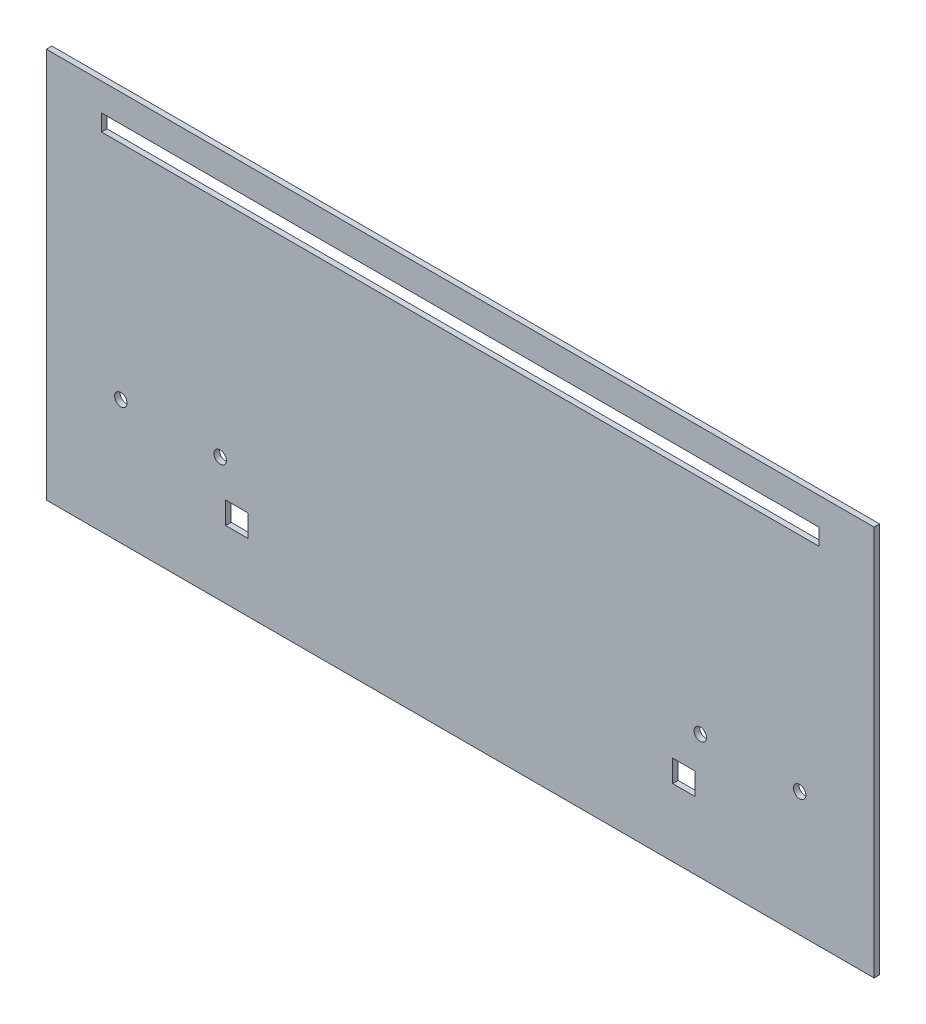
ISO-10303-21;
HEADER;
FILE_DESCRIPTION(('STEP AP214'),'2;1');
FILE_NAME('part.step','',(''),(''),'','','');
FILE_SCHEMA(('AUTOMOTIVE_DESIGN { 1 0 10303 214 1 1 1 1 }'));
ENDSEC;
DATA;
#1=APPLICATION_CONTEXT('core data for automotive mechanical design processes');
#2=APPLICATION_PROTOCOL_DEFINITION('international standard','automotive_design',2000,#1);
#3=PRODUCT_CONTEXT('',#1,'mechanical');
#4=PRODUCT('Part','Part','',(#3));
#5=PRODUCT_RELATED_PRODUCT_CATEGORY('part','',(#4));
#6=PRODUCT_DEFINITION_FORMATION('','',#4);
#7=PRODUCT_DEFINITION_CONTEXT('part definition',#1,'design');
#8=PRODUCT_DEFINITION('design','',#6,#7);
#9=PRODUCT_DEFINITION_SHAPE('','',#8);
#10=(LENGTH_UNIT() NAMED_UNIT(*) SI_UNIT(.MILLI.,.METRE.));
#11=(NAMED_UNIT(*) PLANE_ANGLE_UNIT() SI_UNIT($,.RADIAN.));
#12=(NAMED_UNIT(*) SI_UNIT($,.STERADIAN.) SOLID_ANGLE_UNIT());
#13=UNCERTAINTY_MEASURE_WITH_UNIT(LENGTH_MEASURE(1.E-05),#10,'distance_accuracy_value','');
#14=(GEOMETRIC_REPRESENTATION_CONTEXT(3) GLOBAL_UNCERTAINTY_ASSIGNED_CONTEXT((#13)) GLOBAL_UNIT_ASSIGNED_CONTEXT((#10,
#11,#12)) REPRESENTATION_CONTEXT('',''));
#15=CARTESIAN_POINT('',(0.,0.,0.));
#16=DIRECTION('',(0.,0.,1.));
#17=DIRECTION('',(1.,0.,0.));
#18=AXIS2_PLACEMENT_3D('',#15,#16,#17);
#19=CARTESIAN_POINT('',(0.,0.,2.));
#20=DIRECTION('',(0.,0.,-1.));
#21=DIRECTION('',(-1.,0.,0.));
#22=AXIS2_PLACEMENT_3D('',#19,#20,#21);
#23=PLANE('',#22);
#24=DIRECTION('',(0.,-1.,0.));
#25=VECTOR('',#24,1.);
#26=CARTESIAN_POINT('',(-85.,24.5,2.));
#27=LINE('',#26,#25);
#28=CARTESIAN_POINT('',(-85.,32.5,2.));
#29=VERTEX_POINT('',#28);
#30=CARTESIAN_POINT('',(-85.,24.5,2.));
#31=VERTEX_POINT('',#30);
#32=EDGE_CURVE('E210',#29,#31,#27,.T.);
#33=ORIENTED_EDGE('',*,*,#32,.F.);
#34=DIRECTION('',(-1.,0.,0.));
#35=VECTOR('',#34,1.);
#36=CARTESIAN_POINT('',(-85.,32.5,2.));
#37=LINE('',#36,#35);
#38=CARTESIAN_POINT('',(-77.,32.5,2.));
#39=VERTEX_POINT('',#38);
#40=EDGE_CURVE('E205',#39,#29,#37,.T.);
#41=ORIENTED_EDGE('',*,*,#40,.F.);
#42=DIRECTION('',(0.,1.,0.));
#43=VECTOR('',#42,1.);
#44=CARTESIAN_POINT('',(-77.,24.5,2.));
#45=LINE('',#44,#43);
#46=CARTESIAN_POINT('',(-77.,24.5,2.));
#47=VERTEX_POINT('',#46);
#48=EDGE_CURVE('E217',#47,#39,#45,.T.);
#49=ORIENTED_EDGE('',*,*,#48,.F.);
#50=DIRECTION('',(1.,0.,0.));
#51=VECTOR('',#50,1.);
#52=CARTESIAN_POINT('',(-85.,24.5,2.));
#53=LINE('',#52,#51);
#54=EDGE_CURVE('E219',#31,#47,#53,.T.);
#55=ORIENTED_EDGE('',*,*,#54,.F.);
#56=EDGE_LOOP('',(#33,#41,#49,#55));
#57=FACE_BOUND('',#56,.T.);
#58=CARTESIAN_POINT('',(123.,45.,2.));
#59=DIRECTION('',(0.,0.,1.));
#60=DIRECTION('',(1.,0.,0.));
#61=AXIS2_PLACEMENT_3D('',#58,#59,#60);
#62=CIRCLE('',#61,2.25);
#63=CARTESIAN_POINT('',(125.25,45.,2.));
#64=VERTEX_POINT('',#63);
#65=EDGE_CURVE('E223',#64,#64,#62,.T.);
#66=ORIENTED_EDGE('',*,*,#65,.F.);
#67=EDGE_LOOP('',(#66));
#68=FACE_BOUND('',#67,.T.);
#69=CARTESIAN_POINT('',(-87.,45.,2.));
#70=DIRECTION('',(0.,0.,1.));
#71=DIRECTION('',(1.,0.,0.));
#72=AXIS2_PLACEMENT_3D('',#69,#70,#71);
#73=CIRCLE('',#72,2.25);
#74=CARTESIAN_POINT('',(-84.75,45.,2.));
#75=VERTEX_POINT('',#74);
#76=EDGE_CURVE('E171',#75,#75,#73,.T.);
#77=ORIENTED_EDGE('',*,*,#76,.F.);
#78=EDGE_LOOP('',(#77));
#79=FACE_BOUND('',#78,.T.);
#80=CARTESIAN_POINT('',(-123.,45.,2.));
#81=DIRECTION('',(0.,0.,1.));
#82=DIRECTION('',(1.,0.,0.));
#83=AXIS2_PLACEMENT_3D('',#80,#81,#82);
#84=CIRCLE('',#83,2.25);
#85=CARTESIAN_POINT('',(-120.75,45.,2.));
#86=VERTEX_POINT('',#85);
#87=EDGE_CURVE('E235',#86,#86,#84,.T.);
#88=ORIENTED_EDGE('',*,*,#87,.F.);
#89=EDGE_LOOP('',(#88));
#90=FACE_BOUND('',#89,.T.);
#91=CARTESIAN_POINT('',(87.,45.,2.));
#92=DIRECTION('',(0.,0.,1.));
#93=DIRECTION('',(1.,0.,0.));
#94=AXIS2_PLACEMENT_3D('',#91,#92,#93);
#95=CIRCLE('',#94,2.25);
#96=CARTESIAN_POINT('',(89.25,45.,2.));
#97=VERTEX_POINT('',#96);
#98=EDGE_CURVE('E240',#97,#97,#95,.T.);
#99=ORIENTED_EDGE('',*,*,#98,.F.);
#100=EDGE_LOOP('',(#99));
#101=FACE_BOUND('',#100,.T.);
#102=DIRECTION('',(0.,-1.,0.));
#103=VECTOR('',#102,1.);
#104=CARTESIAN_POINT('',(-150.,0.,2.));
#105=LINE('',#104,#103);
#106=CARTESIAN_POINT('',(-150.,141.5,2.));
#107=VERTEX_POINT('',#106);
#108=CARTESIAN_POINT('',(-150.,0.,2.));
#109=VERTEX_POINT('',#108);
#110=EDGE_CURVE('E277',#107,#109,#105,.T.);
#111=ORIENTED_EDGE('',*,*,#110,.T.);
#112=DIRECTION('',(1.,0.,0.));
#113=VECTOR('',#112,1.);
#114=CARTESIAN_POINT('',(-150.,0.,2.));
#115=LINE('',#114,#113);
#116=CARTESIAN_POINT('',(150.,0.,2.));
#117=VERTEX_POINT('',#116);
#118=EDGE_CURVE('E276',#109,#117,#115,.T.);
#119=ORIENTED_EDGE('',*,*,#118,.T.);
#120=DIRECTION('',(0.,1.,0.));
#121=VECTOR('',#120,1.);
#122=CARTESIAN_POINT('',(150.,0.,2.));
#123=LINE('',#122,#121);
#124=CARTESIAN_POINT('',(150.,141.5,2.));
#125=VERTEX_POINT('',#124);
#126=EDGE_CURVE('E285',#117,#125,#123,.T.);
#127=ORIENTED_EDGE('',*,*,#126,.T.);
#128=DIRECTION('',(-1.,0.,0.));
#129=VECTOR('',#128,1.);
#130=CARTESIAN_POINT('',(-150.,141.5,2.));
#131=LINE('',#130,#129);
#132=EDGE_CURVE('E281',#125,#107,#131,.T.);
#133=ORIENTED_EDGE('',*,*,#132,.T.);
#134=EDGE_LOOP('',(#111,#119,#127,#133));
#135=FACE_BOUND('',#134,.T.);
#136=DIRECTION('',(0.,-1.,0.));
#137=VECTOR('',#136,1.);
#138=CARTESIAN_POINT('',(-130.,125.5,2.));
#139=LINE('',#138,#137);
#140=CARTESIAN_POINT('',(-130.,131.5,2.));
#141=VERTEX_POINT('',#140);
#142=CARTESIAN_POINT('',(-130.,125.5,2.));
#143=VERTEX_POINT('',#142);
#144=EDGE_CURVE('E244',#141,#143,#139,.T.);
#145=ORIENTED_EDGE('',*,*,#144,.F.);
#146=DIRECTION('',(-1.,0.,0.));
#147=VECTOR('',#146,1.);
#148=CARTESIAN_POINT('',(-130.,131.5,2.));
#149=LINE('',#148,#147);
#150=CARTESIAN_POINT('',(130.,131.5,2.));
#151=VERTEX_POINT('',#150);
#152=EDGE_CURVE('E254',#151,#141,#149,.T.);
#153=ORIENTED_EDGE('',*,*,#152,.F.);
#154=DIRECTION('',(0.,1.,0.));
#155=VECTOR('',#154,1.);
#156=CARTESIAN_POINT('',(130.,125.5,2.));
#157=LINE('',#156,#155);
#158=CARTESIAN_POINT('',(130.,125.5,2.));
#159=VERTEX_POINT('',#158);
#160=EDGE_CURVE('E249',#159,#151,#157,.T.);
#161=ORIENTED_EDGE('',*,*,#160,.F.);
#162=DIRECTION('',(1.,0.,0.));
#163=VECTOR('',#162,1.);
#164=CARTESIAN_POINT('',(-130.,125.5,2.));
#165=LINE('',#164,#163);
#166=EDGE_CURVE('E250',#143,#159,#165,.T.);
#167=ORIENTED_EDGE('',*,*,#166,.F.);
#168=EDGE_LOOP('',(#145,#153,#161,#167));
#169=FACE_BOUND('',#168,.T.);
#170=DIRECTION('',(0.,-1.,0.));
#171=VECTOR('',#170,1.);
#172=CARTESIAN_POINT('',(77.,24.5,2.));
#173=LINE('',#172,#171);
#174=CARTESIAN_POINT('',(77.,32.5,2.));
#175=VERTEX_POINT('',#174);
#176=CARTESIAN_POINT('',(77.,24.5,2.));
#177=VERTEX_POINT('',#176);
#178=EDGE_CURVE('E154',#175,#177,#173,.T.);
#179=ORIENTED_EDGE('',*,*,#178,.F.);
#180=DIRECTION('',(-1.,0.,0.));
#181=VECTOR('',#180,1.);
#182=CARTESIAN_POINT('',(77.,32.5,2.));
#183=LINE('',#182,#181);
#184=CARTESIAN_POINT('',(85.,32.5,2.));
#185=VERTEX_POINT('',#184);
#186=EDGE_CURVE('E180',#185,#175,#183,.T.);
#187=ORIENTED_EDGE('',*,*,#186,.F.);
#188=DIRECTION('',(0.,1.,0.));
#189=VECTOR('',#188,1.);
#190=CARTESIAN_POINT('',(85.,24.5,2.));
#191=LINE('',#190,#189);
#192=CARTESIAN_POINT('',(85.,24.5,2.));
#193=VERTEX_POINT('',#192);
#194=EDGE_CURVE('E174',#193,#185,#191,.T.);
#195=ORIENTED_EDGE('',*,*,#194,.F.);
#196=DIRECTION('',(1.,0.,0.));
#197=VECTOR('',#196,1.);
#198=CARTESIAN_POINT('',(77.,24.5,2.));
#199=LINE('',#198,#197);
#200=EDGE_CURVE('E161',#177,#193,#199,.T.);
#201=ORIENTED_EDGE('',*,*,#200,.F.);
#202=EDGE_LOOP('',(#179,#187,#195,#201));
#203=FACE_BOUND('',#202,.T.);
#204=ADVANCED_FACE('F39',(#57,#68,#79,#90,#101,#135,#169,#203),#23,.F.);
#205=CARTESIAN_POINT('',(0.,0.,0.));
#206=DIRECTION('',(0.,0.,-1.));
#207=DIRECTION('',(-1.,0.,0.));
#208=AXIS2_PLACEMENT_3D('',#205,#206,#207);
#209=PLANE('',#208);
#210=CARTESIAN_POINT('',(123.,45.,0.));
#211=DIRECTION('',(0.,0.,1.));
#212=DIRECTION('',(1.,0.,0.));
#213=AXIS2_PLACEMENT_3D('',#210,#211,#212);
#214=CIRCLE('',#213,2.25);
#215=CARTESIAN_POINT('',(125.25,45.,0.));
#216=VERTEX_POINT('',#215);
#217=EDGE_CURVE('E224',#216,#216,#214,.T.);
#218=ORIENTED_EDGE('',*,*,#217,.T.);
#219=EDGE_LOOP('',(#218));
#220=FACE_BOUND('',#219,.T.);
#221=CARTESIAN_POINT('',(-87.,45.,0.));
#222=DIRECTION('',(0.,0.,1.));
#223=DIRECTION('',(1.,0.,0.));
#224=AXIS2_PLACEMENT_3D('',#221,#222,#223);
#225=CIRCLE('',#224,2.25);
#226=CARTESIAN_POINT('',(-84.75,45.,0.));
#227=VERTEX_POINT('',#226);
#228=EDGE_CURVE('E230',#227,#227,#225,.T.);
#229=ORIENTED_EDGE('',*,*,#228,.T.);
#230=EDGE_LOOP('',(#229));
#231=FACE_BOUND('',#230,.T.);
#232=CARTESIAN_POINT('',(-123.,45.,0.));
#233=DIRECTION('',(0.,0.,1.));
#234=DIRECTION('',(1.,0.,0.));
#235=AXIS2_PLACEMENT_3D('',#232,#233,#234);
#236=CIRCLE('',#235,2.25);
#237=CARTESIAN_POINT('',(-120.75,45.,0.));
#238=VERTEX_POINT('',#237);
#239=EDGE_CURVE('E239',#238,#238,#236,.T.);
#240=ORIENTED_EDGE('',*,*,#239,.T.);
#241=EDGE_LOOP('',(#240));
#242=FACE_BOUND('',#241,.T.);
#243=CARTESIAN_POINT('',(87.,45.,0.));
#244=DIRECTION('',(0.,0.,1.));
#245=DIRECTION('',(1.,0.,0.));
#246=AXIS2_PLACEMENT_3D('',#243,#244,#245);
#247=CIRCLE('',#246,2.25);
#248=CARTESIAN_POINT('',(89.25,45.,0.));
#249=VERTEX_POINT('',#248);
#250=EDGE_CURVE('E226',#249,#249,#247,.T.);
#251=ORIENTED_EDGE('',*,*,#250,.T.);
#252=EDGE_LOOP('',(#251));
#253=FACE_BOUND('',#252,.T.);
#254=DIRECTION('',(0.,-1.,0.));
#255=VECTOR('',#254,1.);
#256=CARTESIAN_POINT('',(-150.,0.,0.));
#257=LINE('',#256,#255);
#258=CARTESIAN_POINT('',(-150.,141.5,0.));
#259=VERTEX_POINT('',#258);
#260=CARTESIAN_POINT('',(-150.,0.,0.));
#261=VERTEX_POINT('',#260);
#262=EDGE_CURVE('E273',#259,#261,#257,.T.);
#263=ORIENTED_EDGE('',*,*,#262,.F.);
#264=DIRECTION('',(-1.,0.,0.));
#265=VECTOR('',#264,1.);
#266=CARTESIAN_POINT('',(-150.,141.5,0.));
#267=LINE('',#266,#265);
#268=CARTESIAN_POINT('',(150.,141.5,0.));
#269=VERTEX_POINT('',#268);
#270=EDGE_CURVE('E278',#269,#259,#267,.T.);
#271=ORIENTED_EDGE('',*,*,#270,.F.);
#272=DIRECTION('',(0.,1.,0.));
#273=VECTOR('',#272,1.);
#274=CARTESIAN_POINT('',(150.,0.,0.));
#275=LINE('',#274,#273);
#276=CARTESIAN_POINT('',(150.,0.,0.));
#277=VERTEX_POINT('',#276);
#278=EDGE_CURVE('E293',#277,#269,#275,.T.);
#279=ORIENTED_EDGE('',*,*,#278,.F.);
#280=DIRECTION('',(1.,0.,0.));
#281=VECTOR('',#280,1.);
#282=CARTESIAN_POINT('',(-150.,0.,0.));
#283=LINE('',#282,#281);
#284=EDGE_CURVE('E287',#261,#277,#283,.T.);
#285=ORIENTED_EDGE('',*,*,#284,.F.);
#286=EDGE_LOOP('',(#263,#271,#279,#285));
#287=FACE_BOUND('',#286,.T.);
#288=DIRECTION('',(-1.,0.,0.));
#289=VECTOR('',#288,1.);
#290=CARTESIAN_POINT('',(-130.,131.5,0.));
#291=LINE('',#290,#289);
#292=CARTESIAN_POINT('',(130.,131.5,0.));
#293=VERTEX_POINT('',#292);
#294=CARTESIAN_POINT('',(-130.,131.5,0.));
#295=VERTEX_POINT('',#294);
#296=EDGE_CURVE('E247',#293,#295,#291,.T.);
#297=ORIENTED_EDGE('',*,*,#296,.T.);
#298=DIRECTION('',(0.,-1.,0.));
#299=VECTOR('',#298,1.);
#300=CARTESIAN_POINT('',(-130.,125.5,0.));
#301=LINE('',#300,#299);
#302=CARTESIAN_POINT('',(-130.,125.5,0.));
#303=VERTEX_POINT('',#302);
#304=EDGE_CURVE('E222',#295,#303,#301,.T.);
#305=ORIENTED_EDGE('',*,*,#304,.T.);
#306=DIRECTION('',(1.,0.,0.));
#307=VECTOR('',#306,1.);
#308=CARTESIAN_POINT('',(-130.,125.5,0.));
#309=LINE('',#308,#307);
#310=CARTESIAN_POINT('',(130.,125.5,0.));
#311=VERTEX_POINT('',#310);
#312=EDGE_CURVE('E259',#303,#311,#309,.T.);
#313=ORIENTED_EDGE('',*,*,#312,.T.);
#314=DIRECTION('',(0.,1.,0.));
#315=VECTOR('',#314,1.);
#316=CARTESIAN_POINT('',(130.,125.5,0.));
#317=LINE('',#316,#315);
#318=EDGE_CURVE('E262',#311,#293,#317,.T.);
#319=ORIENTED_EDGE('',*,*,#318,.T.);
#320=EDGE_LOOP('',(#297,#305,#313,#319));
#321=FACE_BOUND('',#320,.T.);
#322=DIRECTION('',(-1.,0.,0.));
#323=VECTOR('',#322,1.);
#324=CARTESIAN_POINT('',(-85.,32.5,0.));
#325=LINE('',#324,#323);
#326=CARTESIAN_POINT('',(-77.,32.5,0.));
#327=VERTEX_POINT('',#326);
#328=CARTESIAN_POINT('',(-85.,32.5,0.));
#329=VERTEX_POINT('',#328);
#330=EDGE_CURVE('E201',#327,#329,#325,.T.);
#331=ORIENTED_EDGE('',*,*,#330,.T.);
#332=DIRECTION('',(0.,-1.,0.));
#333=VECTOR('',#332,1.);
#334=CARTESIAN_POINT('',(-85.,24.5,0.));
#335=LINE('',#334,#333);
#336=CARTESIAN_POINT('',(-85.,24.5,0.));
#337=VERTEX_POINT('',#336);
#338=EDGE_CURVE('E182',#329,#337,#335,.T.);
#339=ORIENTED_EDGE('',*,*,#338,.T.);
#340=DIRECTION('',(1.,0.,0.));
#341=VECTOR('',#340,1.);
#342=CARTESIAN_POINT('',(-85.,24.5,0.));
#343=LINE('',#342,#341);
#344=CARTESIAN_POINT('',(-77.,24.5,0.));
#345=VERTEX_POINT('',#344);
#346=EDGE_CURVE('E208',#337,#345,#343,.T.);
#347=ORIENTED_EDGE('',*,*,#346,.T.);
#348=DIRECTION('',(0.,1.,0.));
#349=VECTOR('',#348,1.);
#350=CARTESIAN_POINT('',(-77.,24.5,0.));
#351=LINE('',#350,#349);
#352=EDGE_CURVE('E207',#345,#327,#351,.T.);
#353=ORIENTED_EDGE('',*,*,#352,.T.);
#354=EDGE_LOOP('',(#331,#339,#347,#353));
#355=FACE_BOUND('',#354,.T.);
#356=DIRECTION('',(-1.,0.,0.));
#357=VECTOR('',#356,1.);
#358=CARTESIAN_POINT('',(77.,32.5,0.));
#359=LINE('',#358,#357);
#360=CARTESIAN_POINT('',(85.,32.5,0.));
#361=VERTEX_POINT('',#360);
#362=CARTESIAN_POINT('',(77.,32.5,0.));
#363=VERTEX_POINT('',#362);
#364=EDGE_CURVE('E165',#361,#363,#359,.T.);
#365=ORIENTED_EDGE('',*,*,#364,.T.);
#366=DIRECTION('',(0.,-1.,0.));
#367=VECTOR('',#366,1.);
#368=CARTESIAN_POINT('',(77.,24.5,0.));
#369=LINE('',#368,#367);
#370=CARTESIAN_POINT('',(77.,24.5,0.));
#371=VERTEX_POINT('',#370);
#372=EDGE_CURVE('E181',#363,#371,#369,.T.);
#373=ORIENTED_EDGE('',*,*,#372,.T.);
#374=DIRECTION('',(1.,0.,0.));
#375=VECTOR('',#374,1.);
#376=CARTESIAN_POINT('',(77.,24.5,0.));
#377=LINE('',#376,#375);
#378=CARTESIAN_POINT('',(85.,24.5,0.));
#379=VERTEX_POINT('',#378);
#380=EDGE_CURVE('E167',#371,#379,#377,.T.);
#381=ORIENTED_EDGE('',*,*,#380,.T.);
#382=DIRECTION('',(0.,1.,0.));
#383=VECTOR('',#382,1.);
#384=CARTESIAN_POINT('',(85.,24.5,0.));
#385=LINE('',#384,#383);
#386=EDGE_CURVE('E184',#379,#361,#385,.T.);
#387=ORIENTED_EDGE('',*,*,#386,.T.);
#388=EDGE_LOOP('',(#365,#373,#381,#387));
#389=FACE_BOUND('',#388,.T.);
#390=ADVANCED_FACE('F307',(#220,#231,#242,#253,#287,#321,#355,#389),#209,.T.);
#391=CARTESIAN_POINT('',(-150.,0.,2.));
#392=DIRECTION('',(1.,0.,0.));
#393=DIRECTION('',(0.,0.,-1.));
#394=AXIS2_PLACEMENT_3D('',#391,#392,#393);
#395=PLANE('',#394);
#396=ORIENTED_EDGE('',*,*,#262,.T.);
#397=DIRECTION('',(0.,0.,-1.));
#398=VECTOR('',#397,1.);
#399=CARTESIAN_POINT('',(-150.,0.,2.));
#400=LINE('',#399,#398);
#401=EDGE_CURVE('E11',#109,#261,#400,.T.);
#402=ORIENTED_EDGE('',*,*,#401,.F.);
#403=ORIENTED_EDGE('',*,*,#110,.F.);
#404=DIRECTION('',(0.,0.,-1.));
#405=VECTOR('',#404,1.);
#406=CARTESIAN_POINT('',(-150.,141.5,2.));
#407=LINE('',#406,#405);
#408=EDGE_CURVE('E288',#107,#259,#407,.T.);
#409=ORIENTED_EDGE('',*,*,#408,.T.);
#410=EDGE_LOOP('',(#396,#402,#403,#409));
#411=FACE_BOUND('',#410,.T.);
#412=ADVANCED_FACE('F41',(#411),#395,.F.);
#413=CARTESIAN_POINT('',(-150.,0.,2.));
#414=DIRECTION('',(0.,1.,0.));
#415=DIRECTION('',(0.,0.,1.));
#416=AXIS2_PLACEMENT_3D('',#413,#414,#415);
#417=PLANE('',#416);
#418=ORIENTED_EDGE('',*,*,#284,.T.);
#419=DIRECTION('',(0.,0.,-1.));
#420=VECTOR('',#419,1.);
#421=CARTESIAN_POINT('',(150.,0.,2.));
#422=LINE('',#421,#420);
#423=EDGE_CURVE('E50',#117,#277,#422,.T.);
#424=ORIENTED_EDGE('',*,*,#423,.F.);
#425=ORIENTED_EDGE('',*,*,#118,.F.);
#426=ORIENTED_EDGE('',*,*,#401,.T.);
#427=EDGE_LOOP('',(#418,#424,#425,#426));
#428=FACE_BOUND('',#427,.T.);
#429=ADVANCED_FACE('F318',(#428),#417,.F.);
#430=CARTESIAN_POINT('',(150.,0.,2.));
#431=DIRECTION('',(-1.,0.,0.));
#432=DIRECTION('',(0.,0.,1.));
#433=AXIS2_PLACEMENT_3D('',#430,#431,#432);
#434=PLANE('',#433);
#435=ORIENTED_EDGE('',*,*,#278,.T.);
#436=DIRECTION('',(0.,0.,-1.));
#437=VECTOR('',#436,1.);
#438=CARTESIAN_POINT('',(150.,141.5,2.));
#439=LINE('',#438,#437);
#440=EDGE_CURVE('E298',#125,#269,#439,.T.);
#441=ORIENTED_EDGE('',*,*,#440,.F.);
#442=ORIENTED_EDGE('',*,*,#126,.F.);
#443=ORIENTED_EDGE('',*,*,#423,.T.);
#444=EDGE_LOOP('',(#435,#441,#442,#443));
#445=FACE_BOUND('',#444,.T.);
#446=ADVANCED_FACE('F303',(#445),#434,.F.);
#447=CARTESIAN_POINT('',(-150.,141.5,2.));
#448=DIRECTION('',(0.,-1.,0.));
#449=DIRECTION('',(0.,0.,-1.));
#450=AXIS2_PLACEMENT_3D('',#447,#448,#449);
#451=PLANE('',#450);
#452=ORIENTED_EDGE('',*,*,#270,.T.);
#453=ORIENTED_EDGE('',*,*,#408,.F.);
#454=ORIENTED_EDGE('',*,*,#132,.F.);
#455=ORIENTED_EDGE('',*,*,#440,.T.);
#456=EDGE_LOOP('',(#452,#453,#454,#455));
#457=FACE_BOUND('',#456,.T.);
#458=ADVANCED_FACE('F312',(#457),#451,.F.);
#459=CARTESIAN_POINT('',(-130.,125.5,2.));
#460=DIRECTION('',(1.,0.,0.));
#461=DIRECTION('',(0.,0.,-1.));
#462=AXIS2_PLACEMENT_3D('',#459,#460,#461);
#463=PLANE('',#462);
#464=ORIENTED_EDGE('',*,*,#304,.F.);
#465=DIRECTION('',(0.,0.,-1.));
#466=VECTOR('',#465,1.);
#467=CARTESIAN_POINT('',(-130.,131.5,2.));
#468=LINE('',#467,#466);
#469=EDGE_CURVE('E253',#141,#295,#468,.T.);
#470=ORIENTED_EDGE('',*,*,#469,.F.);
#471=ORIENTED_EDGE('',*,*,#144,.T.);
#472=DIRECTION('',(0.,0.,-1.));
#473=VECTOR('',#472,1.);
#474=CARTESIAN_POINT('',(-130.,125.5,2.));
#475=LINE('',#474,#473);
#476=EDGE_CURVE('E275',#143,#303,#475,.T.);
#477=ORIENTED_EDGE('',*,*,#476,.T.);
#478=EDGE_LOOP('',(#464,#470,#471,#477));
#479=FACE_BOUND('',#478,.T.);
#480=ADVANCED_FACE('F339',(#479),#463,.T.);
#481=CARTESIAN_POINT('',(-130.,125.5,2.));
#482=DIRECTION('',(0.,1.,0.));
#483=DIRECTION('',(0.,0.,1.));
#484=AXIS2_PLACEMENT_3D('',#481,#482,#483);
#485=PLANE('',#484);
#486=ORIENTED_EDGE('',*,*,#312,.F.);
#487=ORIENTED_EDGE('',*,*,#476,.F.);
#488=ORIENTED_EDGE('',*,*,#166,.T.);
#489=DIRECTION('',(0.,0.,-1.));
#490=VECTOR('',#489,1.);
#491=CARTESIAN_POINT('',(130.,125.5,2.));
#492=LINE('',#491,#490);
#493=EDGE_CURVE('E269',#159,#311,#492,.T.);
#494=ORIENTED_EDGE('',*,*,#493,.T.);
#495=EDGE_LOOP('',(#486,#487,#488,#494));
#496=FACE_BOUND('',#495,.T.);
#497=ADVANCED_FACE('F347',(#496),#485,.T.);
#498=CARTESIAN_POINT('',(130.,125.5,2.));
#499=DIRECTION('',(-1.,0.,0.));
#500=DIRECTION('',(0.,0.,1.));
#501=AXIS2_PLACEMENT_3D('',#498,#499,#500);
#502=PLANE('',#501);
#503=ORIENTED_EDGE('',*,*,#318,.F.);
#504=ORIENTED_EDGE('',*,*,#493,.F.);
#505=ORIENTED_EDGE('',*,*,#160,.T.);
#506=DIRECTION('',(0.,0.,-1.));
#507=VECTOR('',#506,1.);
#508=CARTESIAN_POINT('',(130.,131.5,2.));
#509=LINE('',#508,#507);
#510=EDGE_CURVE('E266',#151,#293,#509,.T.);
#511=ORIENTED_EDGE('',*,*,#510,.T.);
#512=EDGE_LOOP('',(#503,#504,#505,#511));
#513=FACE_BOUND('',#512,.T.);
#514=ADVANCED_FACE('F353',(#513),#502,.T.);
#515=CARTESIAN_POINT('',(-130.,131.5,2.));
#516=DIRECTION('',(0.,-1.,0.));
#517=DIRECTION('',(0.,0.,-1.));
#518=AXIS2_PLACEMENT_3D('',#515,#516,#517);
#519=PLANE('',#518);
#520=ORIENTED_EDGE('',*,*,#296,.F.);
#521=ORIENTED_EDGE('',*,*,#510,.F.);
#522=ORIENTED_EDGE('',*,*,#152,.T.);
#523=ORIENTED_EDGE('',*,*,#469,.T.);
#524=EDGE_LOOP('',(#520,#521,#522,#523));
#525=FACE_BOUND('',#524,.T.);
#526=ADVANCED_FACE('F356',(#525),#519,.T.);
#527=CARTESIAN_POINT('',(87.,45.,2.));
#528=DIRECTION('',(0.,0.,-1.));
#529=DIRECTION('',(-1.,0.,0.));
#530=AXIS2_PLACEMENT_3D('',#527,#528,#529);
#531=CYLINDRICAL_SURFACE('',#530,2.25);
#532=ORIENTED_EDGE('',*,*,#98,.T.);
#533=EDGE_LOOP('',(#532));
#534=FACE_BOUND('',#533,.T.);
#535=ORIENTED_EDGE('',*,*,#250,.F.);
#536=EDGE_LOOP('',(#535));
#537=FACE_BOUND('',#536,.T.);
#538=ADVANCED_FACE('F371',(#534,#537),#531,.F.);
#539=CARTESIAN_POINT('',(-123.,45.,2.));
#540=DIRECTION('',(0.,0.,-1.));
#541=DIRECTION('',(-1.,0.,0.));
#542=AXIS2_PLACEMENT_3D('',#539,#540,#541);
#543=CYLINDRICAL_SURFACE('',#542,2.25);
#544=ORIENTED_EDGE('',*,*,#87,.T.);
#545=EDGE_LOOP('',(#544));
#546=FACE_BOUND('',#545,.T.);
#547=ORIENTED_EDGE('',*,*,#239,.F.);
#548=EDGE_LOOP('',(#547));
#549=FACE_BOUND('',#548,.T.);
#550=ADVANCED_FACE('F372',(#546,#549),#543,.F.);
#551=CARTESIAN_POINT('',(-87.,45.,2.));
#552=DIRECTION('',(0.,0.,-1.));
#553=DIRECTION('',(-1.,0.,0.));
#554=AXIS2_PLACEMENT_3D('',#551,#552,#553);
#555=CYLINDRICAL_SURFACE('',#554,2.25);
#556=ORIENTED_EDGE('',*,*,#76,.T.);
#557=EDGE_LOOP('',(#556));
#558=FACE_BOUND('',#557,.T.);
#559=ORIENTED_EDGE('',*,*,#228,.F.);
#560=EDGE_LOOP('',(#559));
#561=FACE_BOUND('',#560,.T.);
#562=ADVANCED_FACE('F380',(#558,#561),#555,.F.);
#563=CARTESIAN_POINT('',(123.,45.,2.));
#564=DIRECTION('',(0.,0.,-1.));
#565=DIRECTION('',(-1.,0.,0.));
#566=AXIS2_PLACEMENT_3D('',#563,#564,#565);
#567=CYLINDRICAL_SURFACE('',#566,2.25);
#568=ORIENTED_EDGE('',*,*,#65,.T.);
#569=EDGE_LOOP('',(#568));
#570=FACE_BOUND('',#569,.T.);
#571=ORIENTED_EDGE('',*,*,#217,.F.);
#572=EDGE_LOOP('',(#571));
#573=FACE_BOUND('',#572,.T.);
#574=ADVANCED_FACE('F381',(#570,#573),#567,.F.);
#575=CARTESIAN_POINT('',(-85.,24.5,2.));
#576=DIRECTION('',(1.,0.,0.));
#577=DIRECTION('',(0.,0.,-1.));
#578=AXIS2_PLACEMENT_3D('',#575,#576,#577);
#579=PLANE('',#578);
#580=ORIENTED_EDGE('',*,*,#338,.F.);
#581=DIRECTION('',(0.,0.,-1.));
#582=VECTOR('',#581,1.);
#583=CARTESIAN_POINT('',(-85.,32.5,2.));
#584=LINE('',#583,#582);
#585=EDGE_CURVE('E196',#29,#329,#584,.T.);
#586=ORIENTED_EDGE('',*,*,#585,.F.);
#587=ORIENTED_EDGE('',*,*,#32,.T.);
#588=DIRECTION('',(0.,0.,-1.));
#589=VECTOR('',#588,1.);
#590=CARTESIAN_POINT('',(-85.,24.5,2.));
#591=LINE('',#590,#589);
#592=EDGE_CURVE('E194',#31,#337,#591,.T.);
#593=ORIENTED_EDGE('',*,*,#592,.T.);
#594=EDGE_LOOP('',(#580,#586,#587,#593));
#595=FACE_BOUND('',#594,.T.);
#596=ADVANCED_FACE('F390',(#595),#579,.T.);
#597=CARTESIAN_POINT('',(-85.,24.5,2.));
#598=DIRECTION('',(0.,1.,0.));
#599=DIRECTION('',(0.,0.,1.));
#600=AXIS2_PLACEMENT_3D('',#597,#598,#599);
#601=PLANE('',#600);
#602=ORIENTED_EDGE('',*,*,#346,.F.);
#603=ORIENTED_EDGE('',*,*,#592,.F.);
#604=ORIENTED_EDGE('',*,*,#54,.T.);
#605=DIRECTION('',(0.,0.,-1.));
#606=VECTOR('',#605,1.);
#607=CARTESIAN_POINT('',(-77.,24.5,2.));
#608=LINE('',#607,#606);
#609=EDGE_CURVE('E197',#47,#345,#608,.T.);
#610=ORIENTED_EDGE('',*,*,#609,.T.);
#611=EDGE_LOOP('',(#602,#603,#604,#610));
#612=FACE_BOUND('',#611,.T.);
#613=ADVANCED_FACE('F393',(#612),#601,.T.);
#614=CARTESIAN_POINT('',(-77.,24.5,2.));
#615=DIRECTION('',(-1.,0.,0.));
#616=DIRECTION('',(0.,0.,1.));
#617=AXIS2_PLACEMENT_3D('',#614,#615,#616);
#618=PLANE('',#617);
#619=ORIENTED_EDGE('',*,*,#352,.F.);
#620=ORIENTED_EDGE('',*,*,#609,.F.);
#621=ORIENTED_EDGE('',*,*,#48,.T.);
#622=DIRECTION('',(0.,0.,-1.));
#623=VECTOR('',#622,1.);
#624=CARTESIAN_POINT('',(-77.,32.5,2.));
#625=LINE('',#624,#623);
#626=EDGE_CURVE('E65',#39,#327,#625,.T.);
#627=ORIENTED_EDGE('',*,*,#626,.T.);
#628=EDGE_LOOP('',(#619,#620,#621,#627));
#629=FACE_BOUND('',#628,.T.);
#630=ADVANCED_FACE('F395',(#629),#618,.T.);
#631=CARTESIAN_POINT('',(-85.,32.5,2.));
#632=DIRECTION('',(0.,-1.,0.));
#633=DIRECTION('',(0.,0.,-1.));
#634=AXIS2_PLACEMENT_3D('',#631,#632,#633);
#635=PLANE('',#634);
#636=ORIENTED_EDGE('',*,*,#330,.F.);
#637=ORIENTED_EDGE('',*,*,#626,.F.);
#638=ORIENTED_EDGE('',*,*,#40,.T.);
#639=ORIENTED_EDGE('',*,*,#585,.T.);
#640=EDGE_LOOP('',(#636,#637,#638,#639));
#641=FACE_BOUND('',#640,.T.);
#642=ADVANCED_FACE('F386',(#641),#635,.T.);
#643=CARTESIAN_POINT('',(77.,24.5,2.));
#644=DIRECTION('',(1.,0.,0.));
#645=DIRECTION('',(0.,0.,-1.));
#646=AXIS2_PLACEMENT_3D('',#643,#644,#645);
#647=PLANE('',#646);
#648=ORIENTED_EDGE('',*,*,#372,.F.);
#649=DIRECTION('',(0.,0.,-1.));
#650=VECTOR('',#649,1.);
#651=CARTESIAN_POINT('',(77.,32.5,2.));
#652=LINE('',#651,#650);
#653=EDGE_CURVE('E157',#175,#363,#652,.T.);
#654=ORIENTED_EDGE('',*,*,#653,.F.);
#655=ORIENTED_EDGE('',*,*,#178,.T.);
#656=DIRECTION('',(0.,0.,-1.));
#657=VECTOR('',#656,1.);
#658=CARTESIAN_POINT('',(77.,24.5,2.));
#659=LINE('',#658,#657);
#660=EDGE_CURVE('E158',#177,#371,#659,.T.);
#661=ORIENTED_EDGE('',*,*,#660,.T.);
#662=EDGE_LOOP('',(#648,#654,#655,#661));
#663=FACE_BOUND('',#662,.T.);
#664=ADVANCED_FACE('F153',(#663),#647,.T.);
#665=CARTESIAN_POINT('',(77.,24.5,2.));
#666=DIRECTION('',(0.,1.,0.));
#667=DIRECTION('',(0.,0.,1.));
#668=AXIS2_PLACEMENT_3D('',#665,#666,#667);
#669=PLANE('',#668);
#670=ORIENTED_EDGE('',*,*,#380,.F.);
#671=ORIENTED_EDGE('',*,*,#660,.F.);
#672=ORIENTED_EDGE('',*,*,#200,.T.);
#673=DIRECTION('',(0.,0.,-1.));
#674=VECTOR('',#673,1.);
#675=CARTESIAN_POINT('',(85.,24.5,2.));
#676=LINE('',#675,#674);
#677=EDGE_CURVE('E175',#193,#379,#676,.T.);
#678=ORIENTED_EDGE('',*,*,#677,.T.);
#679=EDGE_LOOP('',(#670,#671,#672,#678));
#680=FACE_BOUND('',#679,.T.);
#681=ADVANCED_FACE('F170',(#680),#669,.T.);
#682=CARTESIAN_POINT('',(85.,24.5,2.));
#683=DIRECTION('',(-1.,0.,0.));
#684=DIRECTION('',(0.,0.,1.));
#685=AXIS2_PLACEMENT_3D('',#682,#683,#684);
#686=PLANE('',#685);
#687=ORIENTED_EDGE('',*,*,#386,.F.);
#688=ORIENTED_EDGE('',*,*,#677,.F.);
#689=ORIENTED_EDGE('',*,*,#194,.T.);
#690=DIRECTION('',(0.,0.,-1.));
#691=VECTOR('',#690,1.);
#692=CARTESIAN_POINT('',(85.,32.5,2.));
#693=LINE('',#692,#691);
#694=EDGE_CURVE('E53',#185,#361,#693,.T.);
#695=ORIENTED_EDGE('',*,*,#694,.T.);
#696=EDGE_LOOP('',(#687,#688,#689,#695));
#697=FACE_BOUND('',#696,.T.);
#698=ADVANCED_FACE('F410',(#697),#686,.T.);
#699=CARTESIAN_POINT('',(77.,32.5,2.));
#700=DIRECTION('',(0.,-1.,0.));
#701=DIRECTION('',(0.,0.,-1.));
#702=AXIS2_PLACEMENT_3D('',#699,#700,#701);
#703=PLANE('',#702);
#704=ORIENTED_EDGE('',*,*,#364,.F.);
#705=ORIENTED_EDGE('',*,*,#694,.F.);
#706=ORIENTED_EDGE('',*,*,#186,.T.);
#707=ORIENTED_EDGE('',*,*,#653,.T.);
#708=EDGE_LOOP('',(#704,#705,#706,#707));
#709=FACE_BOUND('',#708,.T.);
#710=ADVANCED_FACE('F408',(#709),#703,.T.);
#711=CLOSED_SHELL('',(#204,#390,#412,#429,#446,#458,#480,#497,#514,#526,#538,#550,#562,#574,
#596,#613,#630,#642,#664,#681,#698,#710));
#712=MANIFOLD_SOLID_BREP('B2',#711);
#713=ADVANCED_BREP_SHAPE_REPRESENTATION('',(#18,#712),#14);
#714=SHAPE_DEFINITION_REPRESENTATION(#9,#713);
ENDSEC;
END-ISO-10303-21;
